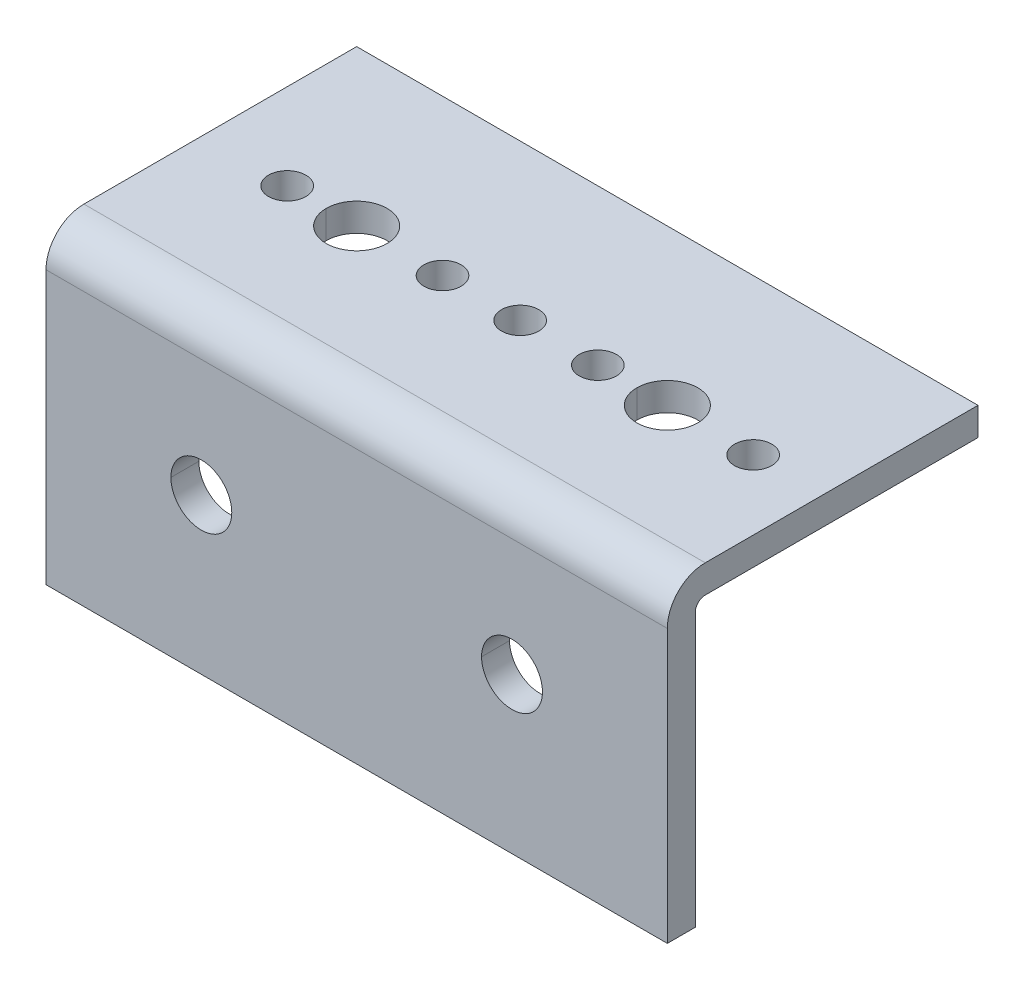
ISO-10303-21;
HEADER;
FILE_DESCRIPTION(('STEP AP214'),'2;1');
FILE_NAME('part.step','',(''),(''),'','','');
FILE_SCHEMA(('AUTOMOTIVE_DESIGN { 1 0 10303 214 1 1 1 1 }'));
ENDSEC;
DATA;
#1=APPLICATION_CONTEXT('core data for automotive mechanical design processes');
#2=APPLICATION_PROTOCOL_DEFINITION('international standard','automotive_design',2000,#1);
#3=PRODUCT_CONTEXT('',#1,'mechanical');
#4=PRODUCT('Part','Part','',(#3));
#5=PRODUCT_RELATED_PRODUCT_CATEGORY('part','',(#4));
#6=PRODUCT_DEFINITION_FORMATION('','',#4);
#7=PRODUCT_DEFINITION_CONTEXT('part definition',#1,'design');
#8=PRODUCT_DEFINITION('design','',#6,#7);
#9=PRODUCT_DEFINITION_SHAPE('','',#8);
#10=(LENGTH_UNIT() NAMED_UNIT(*) SI_UNIT(.MILLI.,.METRE.));
#11=(NAMED_UNIT(*) PLANE_ANGLE_UNIT() SI_UNIT($,.RADIAN.));
#12=(NAMED_UNIT(*) SI_UNIT($,.STERADIAN.) SOLID_ANGLE_UNIT());
#13=UNCERTAINTY_MEASURE_WITH_UNIT(LENGTH_MEASURE(1.E-05),#10,'distance_accuracy_value','');
#14=(GEOMETRIC_REPRESENTATION_CONTEXT(3) GLOBAL_UNCERTAINTY_ASSIGNED_CONTEXT((#13)) GLOBAL_UNIT_ASSIGNED_CONTEXT((#10,
#11,#12)) REPRESENTATION_CONTEXT('',''));
#15=CARTESIAN_POINT('',(0.,0.,0.));
#16=DIRECTION('',(0.,0.,1.));
#17=DIRECTION('',(1.,0.,0.));
#18=AXIS2_PLACEMENT_3D('',#15,#16,#17);
#19=CARTESIAN_POINT('',(-38.1,-25.4,25.4));
#20=DIRECTION('',(0.,0.,-1.));
#21=DIRECTION('',(1.,0.,0.));
#22=AXIS2_PLACEMENT_3D('',#19,#20,#21);
#23=CYLINDRICAL_SURFACE('',#22,2.4892);
#24=DIRECTION('',(0.,0.,-1.));
#25=VECTOR('',#24,1.);
#26=CARTESIAN_POINT('',(-40.5892,-25.4,25.4));
#27=LINE('',#26,#25);
#28=CARTESIAN_POINT('',(-40.5892,-25.4,25.4));
#29=VERTEX_POINT('',#28);
#30=CARTESIAN_POINT('',(-40.5892,-25.4,23.114));
#31=VERTEX_POINT('',#30);
#32=EDGE_CURVE('E160',#29,#31,#27,.T.);
#33=ORIENTED_EDGE('',*,*,#32,.F.);
#34=CARTESIAN_POINT('',(-38.1,-25.4,25.4));
#35=DIRECTION('',(0.,0.,-1.));
#36=DIRECTION('',(1.,0.,0.));
#37=AXIS2_PLACEMENT_3D('',#34,#35,#36);
#38=CIRCLE('',#37,2.4892);
#39=CARTESIAN_POINT('',(-35.6108,-25.4,25.4));
#40=VERTEX_POINT('',#39);
#41=EDGE_CURVE('E145',#40,#29,#38,.T.);
#42=ORIENTED_EDGE('',*,*,#41,.F.);
#43=DIRECTION('',(0.,0.,-1.));
#44=VECTOR('',#43,1.);
#45=CARTESIAN_POINT('',(-35.6108,-25.4,25.4));
#46=LINE('',#45,#44);
#47=CARTESIAN_POINT('',(-35.6108,-25.4,23.114));
#48=VERTEX_POINT('',#47);
#49=EDGE_CURVE('E168',#40,#48,#46,.T.);
#50=ORIENTED_EDGE('',*,*,#49,.T.);
#51=CARTESIAN_POINT('',(-38.1,-25.4,23.114));
#52=DIRECTION('',(0.,0.,-1.));
#53=DIRECTION('',(1.,0.,0.));
#54=AXIS2_PLACEMENT_3D('',#51,#52,#53);
#55=CIRCLE('',#54,2.4892);
#56=EDGE_CURVE('E58',#48,#31,#55,.T.);
#57=ORIENTED_EDGE('',*,*,#56,.T.);
#58=EDGE_LOOP('',(#33,#42,#50,#57));
#59=FACE_BOUND('',#58,.T.);
#60=ADVANCED_FACE('F47',(#59),#23,.F.);
#61=CARTESIAN_POINT('',(-12.7,-25.4,25.4));
#62=DIRECTION('',(0.,0.,-1.));
#63=DIRECTION('',(1.,0.,0.));
#64=AXIS2_PLACEMENT_3D('',#61,#62,#63);
#65=CYLINDRICAL_SURFACE('',#64,2.4892);
#66=DIRECTION('',(0.,0.,-1.));
#67=VECTOR('',#66,1.);
#68=CARTESIAN_POINT('',(-15.1892,-25.4,25.4));
#69=LINE('',#68,#67);
#70=CARTESIAN_POINT('',(-15.1892,-25.4,25.4));
#71=VERTEX_POINT('',#70);
#72=CARTESIAN_POINT('',(-15.1892,-25.4,23.114));
#73=VERTEX_POINT('',#72);
#74=EDGE_CURVE('E235',#71,#73,#69,.T.);
#75=ORIENTED_EDGE('',*,*,#74,.F.);
#76=CARTESIAN_POINT('',(-12.7,-25.4,25.4));
#77=DIRECTION('',(0.,0.,-1.));
#78=DIRECTION('',(1.,0.,0.));
#79=AXIS2_PLACEMENT_3D('',#76,#77,#78);
#80=CIRCLE('',#79,2.4892);
#81=CARTESIAN_POINT('',(-10.2108,-25.4,25.4));
#82=VERTEX_POINT('',#81);
#83=EDGE_CURVE('E155',#82,#71,#80,.T.);
#84=ORIENTED_EDGE('',*,*,#83,.F.);
#85=DIRECTION('',(0.,0.,-1.));
#86=VECTOR('',#85,1.);
#87=CARTESIAN_POINT('',(-10.2108,-25.4,25.4));
#88=LINE('',#87,#86);
#89=CARTESIAN_POINT('',(-10.2108,-25.4,23.114));
#90=VERTEX_POINT('',#89);
#91=EDGE_CURVE('E206',#82,#90,#88,.T.);
#92=ORIENTED_EDGE('',*,*,#91,.T.);
#93=CARTESIAN_POINT('',(-12.7,-25.4,23.114));
#94=DIRECTION('',(0.,0.,-1.));
#95=DIRECTION('',(1.,0.,0.));
#96=AXIS2_PLACEMENT_3D('',#93,#94,#95);
#97=CIRCLE('',#96,2.4892);
#98=EDGE_CURVE('E12',#90,#73,#97,.T.);
#99=ORIENTED_EDGE('',*,*,#98,.T.);
#100=EDGE_LOOP('',(#75,#84,#92,#99));
#101=FACE_BOUND('',#100,.T.);
#102=ADVANCED_FACE('F486',(#101),#65,.F.);
#103=CARTESIAN_POINT('',(-12.7,-12.7,12.7));
#104=DIRECTION('',(0.,-1.,0.));
#105=DIRECTION('',(-1.,0.,0.));
#106=AXIS2_PLACEMENT_3D('',#103,#104,#105);
#107=CYLINDRICAL_SURFACE('',#106,2.4892);
#108=DIRECTION('',(0.,-1.,0.));
#109=VECTOR('',#108,1.);
#110=CARTESIAN_POINT('',(-10.2108,-12.7,12.7));
#111=LINE('',#110,#109);
#112=CARTESIAN_POINT('',(-10.2108,-12.7,12.7));
#113=VERTEX_POINT('',#112);
#114=CARTESIAN_POINT('',(-10.2108,-14.986,12.7));
#115=VERTEX_POINT('',#114);
#116=EDGE_CURVE('E205',#113,#115,#111,.T.);
#117=ORIENTED_EDGE('',*,*,#116,.F.);
#118=CARTESIAN_POINT('',(-12.7,-12.7,12.7));
#119=DIRECTION('',(0.,-1.,0.));
#120=DIRECTION('',(-1.,0.,0.));
#121=AXIS2_PLACEMENT_3D('',#118,#119,#120);
#122=CIRCLE('',#121,2.4892);
#123=CARTESIAN_POINT('',(-15.1892,-12.7,12.7));
#124=VERTEX_POINT('',#123);
#125=EDGE_CURVE('E285',#124,#113,#122,.T.);
#126=ORIENTED_EDGE('',*,*,#125,.F.);
#127=DIRECTION('',(0.,-1.,0.));
#128=VECTOR('',#127,1.);
#129=CARTESIAN_POINT('',(-15.1892,-12.7,12.7));
#130=LINE('',#129,#128);
#131=CARTESIAN_POINT('',(-15.1892,-14.986,12.7));
#132=VERTEX_POINT('',#131);
#133=EDGE_CURVE('E279',#124,#132,#130,.T.);
#134=ORIENTED_EDGE('',*,*,#133,.T.);
#135=CARTESIAN_POINT('',(-12.7,-14.986,12.7));
#136=DIRECTION('',(0.,-1.,0.));
#137=DIRECTION('',(-1.,0.,0.));
#138=AXIS2_PLACEMENT_3D('',#135,#136,#137);
#139=CIRCLE('',#138,2.4892);
#140=EDGE_CURVE('E273',#132,#115,#139,.T.);
#141=ORIENTED_EDGE('',*,*,#140,.T.);
#142=EDGE_LOOP('',(#117,#126,#134,#141));
#143=FACE_BOUND('',#142,.T.);
#144=ADVANCED_FACE('F49',(#143),#107,.F.);
#145=CARTESIAN_POINT('',(-38.1,-12.7,12.7));
#146=DIRECTION('',(0.,-1.,0.));
#147=DIRECTION('',(-1.,0.,0.));
#148=AXIS2_PLACEMENT_3D('',#145,#146,#147);
#149=CYLINDRICAL_SURFACE('',#148,2.4892);
#150=DIRECTION('',(0.,-1.,0.));
#151=VECTOR('',#150,1.);
#152=CARTESIAN_POINT('',(-35.6108,-12.7,12.7));
#153=LINE('',#152,#151);
#154=CARTESIAN_POINT('',(-35.6108,-12.7,12.7));
#155=VERTEX_POINT('',#154);
#156=CARTESIAN_POINT('',(-35.6108,-14.986,12.7));
#157=VERTEX_POINT('',#156);
#158=EDGE_CURVE('E181',#155,#157,#153,.T.);
#159=ORIENTED_EDGE('',*,*,#158,.F.);
#160=CARTESIAN_POINT('',(-38.1,-12.7,12.7));
#161=DIRECTION('',(0.,-1.,0.));
#162=DIRECTION('',(-1.,0.,0.));
#163=AXIS2_PLACEMENT_3D('',#160,#161,#162);
#164=CIRCLE('',#163,2.4892);
#165=CARTESIAN_POINT('',(-40.5892,-12.7,12.7));
#166=VERTEX_POINT('',#165);
#167=EDGE_CURVE('E280',#166,#155,#164,.T.);
#168=ORIENTED_EDGE('',*,*,#167,.F.);
#169=DIRECTION('',(0.,-1.,0.));
#170=VECTOR('',#169,1.);
#171=CARTESIAN_POINT('',(-40.5892,-12.7,12.7));
#172=LINE('',#171,#170);
#173=CARTESIAN_POINT('',(-40.5892,-14.986,12.7));
#174=VERTEX_POINT('',#173);
#175=EDGE_CURVE('E223',#166,#174,#172,.T.);
#176=ORIENTED_EDGE('',*,*,#175,.T.);
#177=CARTESIAN_POINT('',(-38.1,-14.986,12.7));
#178=DIRECTION('',(0.,-1.,0.));
#179=DIRECTION('',(-1.,0.,0.));
#180=AXIS2_PLACEMENT_3D('',#177,#178,#179);
#181=CIRCLE('',#180,2.4892);
#182=EDGE_CURVE('E183',#174,#157,#181,.T.);
#183=ORIENTED_EDGE('',*,*,#182,.T.);
#184=EDGE_LOOP('',(#159,#168,#176,#183));
#185=FACE_BOUND('',#184,.T.);
#186=ADVANCED_FACE('F368',(#185),#149,.F.);
#187=CARTESIAN_POINT('',(-50.8,-12.7,25.400012));
#188=DIRECTION('',(1.,0.,0.));
#189=DIRECTION('',(0.,-1.,0.));
#190=AXIS2_PLACEMENT_3D('',#187,#188,#189);
#191=PLANE('',#190);
#192=CARTESIAN_POINT('',(-50.8,-15.7988,22.3012));
#193=DIRECTION('',(-1.,0.,0.));
#194=DIRECTION('',(0.,-1.,0.));
#195=AXIS2_PLACEMENT_3D('',#192,#193,#194);
#196=CIRCLE('',#195,3.0988);
#197=CARTESIAN_POINT('',(-50.8,-15.7988,25.4));
#198=VERTEX_POINT('',#197);
#199=CARTESIAN_POINT('',(-50.8,-12.7,22.3012));
#200=VERTEX_POINT('',#199);
#201=EDGE_CURVE('E51',#198,#200,#196,.T.);
#202=ORIENTED_EDGE('',*,*,#201,.T.);
#203=DIRECTION('',(0.,0.,-1.));
#204=VECTOR('',#203,1.);
#205=CARTESIAN_POINT('',(-50.8,-12.7,25.400012));
#206=LINE('',#205,#204);
#207=CARTESIAN_POINT('',(-50.8,-12.7,0.));
#208=VERTEX_POINT('',#207);
#209=EDGE_CURVE('E216',#200,#208,#206,.T.);
#210=ORIENTED_EDGE('',*,*,#209,.T.);
#211=DIRECTION('',(0.,-1.,0.));
#212=VECTOR('',#211,1.);
#213=CARTESIAN_POINT('',(-50.8,-12.7,0.));
#214=LINE('',#213,#212);
#215=CARTESIAN_POINT('',(-50.8,-14.986,0.));
#216=VERTEX_POINT('',#215);
#217=EDGE_CURVE('E229',#208,#216,#214,.T.);
#218=ORIENTED_EDGE('',*,*,#217,.T.);
#219=DIRECTION('',(0.,0.,-1.));
#220=VECTOR('',#219,1.);
#221=CARTESIAN_POINT('',(-50.8,-14.986,25.4));
#222=LINE('',#221,#220);
#223=CARTESIAN_POINT('',(-50.8,-14.986,22.3012));
#224=VERTEX_POINT('',#223);
#225=EDGE_CURVE('E274',#224,#216,#222,.T.);
#226=ORIENTED_EDGE('',*,*,#225,.F.);
#227=CARTESIAN_POINT('',(-50.8,-15.7988,22.3012));
#228=DIRECTION('',(-1.,0.,0.));
#229=DIRECTION('',(0.,-1.,0.));
#230=AXIS2_PLACEMENT_3D('',#227,#228,#229);
#231=CIRCLE('',#230,0.8128);
#232=CARTESIAN_POINT('',(-50.8,-15.7988,23.114));
#233=VERTEX_POINT('',#232);
#234=EDGE_CURVE('E253',#233,#224,#231,.T.);
#235=ORIENTED_EDGE('',*,*,#234,.F.);
#236=DIRECTION('',(0.,1.,0.));
#237=VECTOR('',#236,1.);
#238=CARTESIAN_POINT('',(-50.8,-12.7,23.114));
#239=LINE('',#238,#237);
#240=CARTESIAN_POINT('',(-50.8,-38.1,23.114));
#241=VERTEX_POINT('',#240);
#242=EDGE_CURVE('E298',#241,#233,#239,.T.);
#243=ORIENTED_EDGE('',*,*,#242,.F.);
#244=DIRECTION('',(0.,0.,-1.));
#245=VECTOR('',#244,1.);
#246=CARTESIAN_POINT('',(-50.8,-38.1,25.400012));
#247=LINE('',#246,#245);
#248=CARTESIAN_POINT('',(-50.8,-38.1,25.4));
#249=VERTEX_POINT('',#248);
#250=EDGE_CURVE('E259',#249,#241,#247,.T.);
#251=ORIENTED_EDGE('',*,*,#250,.F.);
#252=DIRECTION('',(0.,1.,0.));
#253=VECTOR('',#252,1.);
#254=CARTESIAN_POINT('',(-50.8,-12.7,25.4));
#255=LINE('',#254,#253);
#256=EDGE_CURVE('E193',#249,#198,#255,.T.);
#257=ORIENTED_EDGE('',*,*,#256,.T.);
#258=EDGE_LOOP('',(#202,#210,#218,#226,#235,#243,#251,#257));
#259=FACE_BOUND('',#258,.T.);
#260=ADVANCED_FACE('F326',(#259),#191,.F.);
#261=CARTESIAN_POINT('',(0.,-12.7,25.400012));
#262=DIRECTION('',(1.,0.,0.));
#263=DIRECTION('',(0.,-1.,0.));
#264=AXIS2_PLACEMENT_3D('',#261,#262,#263);
#265=PLANE('',#264);
#266=DIRECTION('',(0.,1.,0.));
#267=VECTOR('',#266,1.);
#268=CARTESIAN_POINT('',(0.,-12.7,25.4));
#269=LINE('',#268,#267);
#270=CARTESIAN_POINT('',(0.,-38.1,25.4));
#271=VERTEX_POINT('',#270);
#272=CARTESIAN_POINT('',(0.,-15.7988,25.4));
#273=VERTEX_POINT('',#272);
#274=EDGE_CURVE('E156',#271,#273,#269,.T.);
#275=ORIENTED_EDGE('',*,*,#274,.F.);
#276=DIRECTION('',(0.,0.,-1.));
#277=VECTOR('',#276,1.);
#278=CARTESIAN_POINT('',(0.,-38.1,25.400012));
#279=LINE('',#278,#277);
#280=CARTESIAN_POINT('',(0.,-38.1,23.114));
#281=VERTEX_POINT('',#280);
#282=EDGE_CURVE('E207',#271,#281,#279,.T.);
#283=ORIENTED_EDGE('',*,*,#282,.T.);
#284=DIRECTION('',(0.,1.,0.));
#285=VECTOR('',#284,1.);
#286=CARTESIAN_POINT('',(0.,-12.7,23.114));
#287=LINE('',#286,#285);
#288=CARTESIAN_POINT('',(0.,-15.7988,23.114));
#289=VERTEX_POINT('',#288);
#290=EDGE_CURVE('E71',#281,#289,#287,.T.);
#291=ORIENTED_EDGE('',*,*,#290,.T.);
#292=CARTESIAN_POINT('',(0.,-15.7988,22.3012));
#293=DIRECTION('',(-1.,0.,0.));
#294=DIRECTION('',(0.,-1.,0.));
#295=AXIS2_PLACEMENT_3D('',#292,#293,#294);
#296=CIRCLE('',#295,0.8128);
#297=CARTESIAN_POINT('',(0.,-14.986,22.3012));
#298=VERTEX_POINT('',#297);
#299=EDGE_CURVE('E264',#289,#298,#296,.T.);
#300=ORIENTED_EDGE('',*,*,#299,.T.);
#301=DIRECTION('',(0.,0.,-1.));
#302=VECTOR('',#301,1.);
#303=CARTESIAN_POINT('',(0.,-14.986,25.4));
#304=LINE('',#303,#302);
#305=CARTESIAN_POINT('',(0.,-14.986,0.));
#306=VERTEX_POINT('',#305);
#307=EDGE_CURVE('E269',#298,#306,#304,.T.);
#308=ORIENTED_EDGE('',*,*,#307,.T.);
#309=DIRECTION('',(0.,-1.,0.));
#310=VECTOR('',#309,1.);
#311=CARTESIAN_POINT('',(0.,-12.7,0.));
#312=LINE('',#311,#310);
#313=CARTESIAN_POINT('',(0.,-12.7,0.));
#314=VERTEX_POINT('',#313);
#315=EDGE_CURVE('E225',#314,#306,#312,.T.);
#316=ORIENTED_EDGE('',*,*,#315,.F.);
#317=DIRECTION('',(0.,0.,-1.));
#318=VECTOR('',#317,1.);
#319=CARTESIAN_POINT('',(0.,-12.7,25.400012));
#320=LINE('',#319,#318);
#321=CARTESIAN_POINT('',(0.,-12.7,22.3012));
#322=VERTEX_POINT('',#321);
#323=EDGE_CURVE('E348',#322,#314,#320,.T.);
#324=ORIENTED_EDGE('',*,*,#323,.F.);
#325=CARTESIAN_POINT('',(0.,-15.7988,22.3012));
#326=DIRECTION('',(-1.,0.,0.));
#327=DIRECTION('',(0.,-1.,0.));
#328=AXIS2_PLACEMENT_3D('',#325,#326,#327);
#329=CIRCLE('',#328,3.0988);
#330=EDGE_CURVE('E234',#273,#322,#329,.T.);
#331=ORIENTED_EDGE('',*,*,#330,.F.);
#332=EDGE_LOOP('',(#275,#283,#291,#300,#308,#316,#324,#331));
#333=FACE_BOUND('',#332,.T.);
#334=ADVANCED_FACE('F403',(#333),#265,.T.);
#335=CARTESIAN_POINT('',(-787.4,-12.7,23.114));
#336=DIRECTION('',(0.,0.,1.));
#337=DIRECTION('',(-1.,0.,0.));
#338=AXIS2_PLACEMENT_3D('',#335,#336,#337);
#339=PLANE('',#338);
#340=ORIENTED_EDGE('',*,*,#98,.F.);
#341=CARTESIAN_POINT('',(-12.7,-25.4,23.114));
#342=DIRECTION('',(0.,0.,-1.));
#343=DIRECTION('',(1.,0.,0.));
#344=AXIS2_PLACEMENT_3D('',#341,#342,#343);
#345=CIRCLE('',#344,2.4892);
#346=EDGE_CURVE('E390',#73,#90,#345,.T.);
#347=ORIENTED_EDGE('',*,*,#346,.F.);
#348=EDGE_LOOP('',(#340,#347));
#349=FACE_BOUND('',#348,.T.);
#350=ORIENTED_EDGE('',*,*,#56,.F.);
#351=CARTESIAN_POINT('',(-38.1,-25.4,23.114));
#352=DIRECTION('',(0.,0.,-1.));
#353=DIRECTION('',(1.,0.,0.));
#354=AXIS2_PLACEMENT_3D('',#351,#352,#353);
#355=CIRCLE('',#354,2.4892);
#356=EDGE_CURVE('E165',#31,#48,#355,.T.);
#357=ORIENTED_EDGE('',*,*,#356,.F.);
#358=EDGE_LOOP('',(#350,#357));
#359=FACE_BOUND('',#358,.T.);
#360=DIRECTION('',(1.,0.,0.));
#361=VECTOR('',#360,1.);
#362=CARTESIAN_POINT('',(-787.4,-38.1,23.114));
#363=LINE('',#362,#361);
#364=EDGE_CURVE('E263',#241,#281,#363,.T.);
#365=ORIENTED_EDGE('',*,*,#364,.F.);
#366=ORIENTED_EDGE('',*,*,#242,.T.);
#367=DIRECTION('',(-1.,0.,0.));
#368=VECTOR('',#367,1.);
#369=CARTESIAN_POINT('',(-787.4,-15.7988,23.114));
#370=LINE('',#369,#368);
#371=EDGE_CURVE('E249',#289,#233,#370,.T.);
#372=ORIENTED_EDGE('',*,*,#371,.F.);
#373=ORIENTED_EDGE('',*,*,#290,.F.);
#374=EDGE_LOOP('',(#365,#366,#372,#373));
#375=FACE_BOUND('',#374,.T.);
#376=ADVANCED_FACE('F408',(#349,#359,#375),#339,.F.);
#377=CARTESIAN_POINT('',(-787.4,-38.1,23.114));
#378=DIRECTION('',(0.,1.,0.));
#379=DIRECTION('',(1.,0.,0.));
#380=AXIS2_PLACEMENT_3D('',#377,#378,#379);
#381=PLANE('',#380);
#382=DIRECTION('',(1.,0.,0.));
#383=VECTOR('',#382,1.);
#384=CARTESIAN_POINT('',(-787.4,-38.1,25.4));
#385=LINE('',#384,#383);
#386=EDGE_CURVE('E198',#249,#271,#385,.T.);
#387=ORIENTED_EDGE('',*,*,#386,.F.);
#388=ORIENTED_EDGE('',*,*,#250,.T.);
#389=ORIENTED_EDGE('',*,*,#364,.T.);
#390=ORIENTED_EDGE('',*,*,#282,.F.);
#391=EDGE_LOOP('',(#387,#388,#389,#390));
#392=FACE_BOUND('',#391,.T.);
#393=ADVANCED_FACE('F407',(#392),#381,.F.);
#394=CARTESIAN_POINT('',(-787.4,-15.7988,22.3012));
#395=DIRECTION('',(1.,0.,0.));
#396=DIRECTION('',(0.,-1.,0.));
#397=AXIS2_PLACEMENT_3D('',#394,#395,#396);
#398=CYLINDRICAL_SURFACE('',#397,0.8128);
#399=ORIENTED_EDGE('',*,*,#371,.T.);
#400=ORIENTED_EDGE('',*,*,#234,.T.);
#401=DIRECTION('',(-1.,0.,0.));
#402=VECTOR('',#401,1.);
#403=CARTESIAN_POINT('',(-787.4,-14.986,22.3012));
#404=LINE('',#403,#402);
#405=EDGE_CURVE('E199',#298,#224,#404,.T.);
#406=ORIENTED_EDGE('',*,*,#405,.F.);
#407=ORIENTED_EDGE('',*,*,#299,.F.);
#408=EDGE_LOOP('',(#399,#400,#406,#407));
#409=FACE_BOUND('',#408,.T.);
#410=ADVANCED_FACE('F321',(#409),#398,.F.);
#411=CARTESIAN_POINT('',(-787.4,-12.7,25.4));
#412=DIRECTION('',(0.,0.,1.));
#413=DIRECTION('',(-1.,0.,0.));
#414=AXIS2_PLACEMENT_3D('',#411,#412,#413);
#415=PLANE('',#414);
#416=ORIENTED_EDGE('',*,*,#83,.T.);
#417=CARTESIAN_POINT('',(-12.7,-25.4,25.4));
#418=DIRECTION('',(0.,0.,-1.));
#419=DIRECTION('',(1.,0.,0.));
#420=AXIS2_PLACEMENT_3D('',#417,#418,#419);
#421=CIRCLE('',#420,2.4892);
#422=EDGE_CURVE('E244',#71,#82,#421,.T.);
#423=ORIENTED_EDGE('',*,*,#422,.T.);
#424=EDGE_LOOP('',(#416,#423));
#425=FACE_BOUND('',#424,.T.);
#426=ORIENTED_EDGE('',*,*,#41,.T.);
#427=CARTESIAN_POINT('',(-38.1,-25.4,25.4));
#428=DIRECTION('',(0.,0.,-1.));
#429=DIRECTION('',(1.,0.,0.));
#430=AXIS2_PLACEMENT_3D('',#427,#428,#429);
#431=CIRCLE('',#430,2.4892);
#432=EDGE_CURVE('E150',#29,#40,#431,.T.);
#433=ORIENTED_EDGE('',*,*,#432,.T.);
#434=EDGE_LOOP('',(#426,#433));
#435=FACE_BOUND('',#434,.T.);
#436=ORIENTED_EDGE('',*,*,#256,.F.);
#437=ORIENTED_EDGE('',*,*,#386,.T.);
#438=ORIENTED_EDGE('',*,*,#274,.T.);
#439=DIRECTION('',(-1.,0.,0.));
#440=VECTOR('',#439,1.);
#441=CARTESIAN_POINT('',(-787.4,-15.7988,25.4));
#442=LINE('',#441,#440);
#443=EDGE_CURVE('E230',#273,#198,#442,.T.);
#444=ORIENTED_EDGE('',*,*,#443,.T.);
#445=EDGE_LOOP('',(#436,#437,#438,#444));
#446=FACE_BOUND('',#445,.T.);
#447=ADVANCED_FACE('F147',(#425,#435,#446),#415,.T.);
#448=CARTESIAN_POINT('',(-787.4,-14.986,25.4));
#449=DIRECTION('',(0.,1.,0.));
#450=DIRECTION('',(1.,0.,0.));
#451=AXIS2_PLACEMENT_3D('',#448,#449,#450);
#452=PLANE('',#451);
#453=CARTESIAN_POINT('',(-5.68138413389015,-14.986,12.7));
#454=DIRECTION('',(0.,1.,0.));
#455=DIRECTION('',(0.,0.,1.));
#456=AXIS2_PLACEMENT_3D('',#453,#454,#455);
#457=CIRCLE('',#456,1.524);
#458=CARTESIAN_POINT('',(-5.68138413389015,-14.986,14.224));
#459=VERTEX_POINT('',#458);
#460=EDGE_CURVE('E170',#459,#459,#457,.T.);
#461=ORIENTED_EDGE('',*,*,#460,.T.);
#462=EDGE_LOOP('',(#461));
#463=FACE_BOUND('',#462,.T.);
#464=CARTESIAN_POINT('',(-43.7813841338901,-14.986,12.7000000000002));
#465=DIRECTION('',(0.,1.,0.));
#466=DIRECTION('',(0.,0.,1.));
#467=AXIS2_PLACEMENT_3D('',#464,#465,#466);
#468=CIRCLE('',#467,1.524);
#469=CARTESIAN_POINT('',(-43.7813841338901,-14.986,14.2240000000002));
#470=VERTEX_POINT('',#469);
#471=EDGE_CURVE('E176',#470,#470,#468,.T.);
#472=ORIENTED_EDGE('',*,*,#471,.T.);
#473=EDGE_LOOP('',(#472));
#474=FACE_BOUND('',#473,.T.);
#475=CARTESIAN_POINT('',(-31.0813841338901,-14.986,12.7000000000001));
#476=DIRECTION('',(0.,1.,0.));
#477=DIRECTION('',(0.,0.,1.));
#478=AXIS2_PLACEMENT_3D('',#475,#476,#477);
#479=CIRCLE('',#478,1.524);
#480=CARTESIAN_POINT('',(-31.0813841338901,-14.986,14.2240000000001));
#481=VERTEX_POINT('',#480);
#482=EDGE_CURVE('E722',#481,#481,#479,.T.);
#483=ORIENTED_EDGE('',*,*,#482,.T.);
#484=EDGE_LOOP('',(#483));
#485=FACE_BOUND('',#484,.T.);
#486=CARTESIAN_POINT('',(-24.7313841338901,-14.986,12.7));
#487=DIRECTION('',(0.,1.,0.));
#488=DIRECTION('',(0.,0.,1.));
#489=AXIS2_PLACEMENT_3D('',#486,#487,#488);
#490=CIRCLE('',#489,1.52400000000001);
#491=CARTESIAN_POINT('',(-24.7313841338901,-14.986,14.2240000000001));
#492=VERTEX_POINT('',#491);
#493=EDGE_CURVE('E726',#492,#492,#490,.T.);
#494=ORIENTED_EDGE('',*,*,#493,.T.);
#495=EDGE_LOOP('',(#494));
#496=FACE_BOUND('',#495,.T.);
#497=CARTESIAN_POINT('',(-18.3813841338902,-14.986,12.7));
#498=DIRECTION('',(0.,1.,0.));
#499=DIRECTION('',(0.,0.,1.));
#500=AXIS2_PLACEMENT_3D('',#497,#498,#499);
#501=CIRCLE('',#500,1.524);
#502=CARTESIAN_POINT('',(-18.3813841338902,-14.986,14.224));
#503=VERTEX_POINT('',#502);
#504=EDGE_CURVE('E729',#503,#503,#501,.T.);
#505=ORIENTED_EDGE('',*,*,#504,.T.);
#506=EDGE_LOOP('',(#505));
#507=FACE_BOUND('',#506,.T.);
#508=ORIENTED_EDGE('',*,*,#182,.F.);
#509=CARTESIAN_POINT('',(-38.1,-14.986,12.7));
#510=DIRECTION('',(0.,-1.,0.));
#511=DIRECTION('',(-1.,0.,0.));
#512=AXIS2_PLACEMENT_3D('',#509,#510,#511);
#513=CIRCLE('',#512,2.4892);
#514=EDGE_CURVE('E305',#157,#174,#513,.T.);
#515=ORIENTED_EDGE('',*,*,#514,.F.);
#516=EDGE_LOOP('',(#508,#515));
#517=FACE_BOUND('',#516,.T.);
#518=ORIENTED_EDGE('',*,*,#140,.F.);
#519=CARTESIAN_POINT('',(-12.7,-14.986,12.7));
#520=DIRECTION('',(0.,-1.,0.));
#521=DIRECTION('',(-1.,0.,0.));
#522=AXIS2_PLACEMENT_3D('',#519,#520,#521);
#523=CIRCLE('',#522,2.4892);
#524=EDGE_CURVE('E275',#115,#132,#523,.T.);
#525=ORIENTED_EDGE('',*,*,#524,.F.);
#526=EDGE_LOOP('',(#518,#525));
#527=FACE_BOUND('',#526,.T.);
#528=ORIENTED_EDGE('',*,*,#405,.T.);
#529=ORIENTED_EDGE('',*,*,#225,.T.);
#530=DIRECTION('',(-1.,0.,0.));
#531=VECTOR('',#530,1.);
#532=CARTESIAN_POINT('',(-787.4,-14.986,0.));
#533=LINE('',#532,#531);
#534=EDGE_CURVE('E256',#306,#216,#533,.T.);
#535=ORIENTED_EDGE('',*,*,#534,.F.);
#536=ORIENTED_EDGE('',*,*,#307,.F.);
#537=EDGE_LOOP('',(#528,#529,#535,#536));
#538=FACE_BOUND('',#537,.T.);
#539=ADVANCED_FACE('F331',(#463,#474,#485,#496,#507,#517,#527,#538),#452,.F.);
#540=CARTESIAN_POINT('',(-787.4,-15.7988,22.3012));
#541=DIRECTION('',(1.,0.,0.));
#542=DIRECTION('',(0.,-1.,0.));
#543=AXIS2_PLACEMENT_3D('',#540,#541,#542);
#544=CYLINDRICAL_SURFACE('',#543,3.0988);
#545=ORIENTED_EDGE('',*,*,#201,.F.);
#546=ORIENTED_EDGE('',*,*,#443,.F.);
#547=ORIENTED_EDGE('',*,*,#330,.T.);
#548=DIRECTION('',(-1.,0.,0.));
#549=VECTOR('',#548,1.);
#550=CARTESIAN_POINT('',(-787.4,-12.7,22.3012));
#551=LINE('',#550,#549);
#552=EDGE_CURVE('E222',#322,#200,#551,.T.);
#553=ORIENTED_EDGE('',*,*,#552,.T.);
#554=EDGE_LOOP('',(#545,#546,#547,#553));
#555=FACE_BOUND('',#554,.T.);
#556=ADVANCED_FACE('F412',(#555),#544,.T.);
#557=CARTESIAN_POINT('',(-787.4,-12.7,0.));
#558=DIRECTION('',(0.,0.,1.));
#559=DIRECTION('',(-1.,0.,0.));
#560=AXIS2_PLACEMENT_3D('',#557,#558,#559);
#561=PLANE('',#560);
#562=ORIENTED_EDGE('',*,*,#534,.T.);
#563=ORIENTED_EDGE('',*,*,#217,.F.);
#564=DIRECTION('',(-1.,0.,0.));
#565=VECTOR('',#564,1.);
#566=CARTESIAN_POINT('',(-787.4,-12.7,0.));
#567=LINE('',#566,#565);
#568=EDGE_CURVE('E385',#314,#208,#567,.T.);
#569=ORIENTED_EDGE('',*,*,#568,.F.);
#570=ORIENTED_EDGE('',*,*,#315,.T.);
#571=EDGE_LOOP('',(#562,#563,#569,#570));
#572=FACE_BOUND('',#571,.T.);
#573=ADVANCED_FACE('F439',(#572),#561,.F.);
#574=CARTESIAN_POINT('',(-787.4,-12.7,25.4));
#575=DIRECTION('',(0.,1.,0.));
#576=DIRECTION('',(1.,0.,0.));
#577=AXIS2_PLACEMENT_3D('',#574,#575,#576);
#578=PLANE('',#577);
#579=CARTESIAN_POINT('',(-5.68138413389015,-12.7,12.7));
#580=DIRECTION('',(0.,1.,0.));
#581=DIRECTION('',(0.,0.,1.));
#582=AXIS2_PLACEMENT_3D('',#579,#580,#581);
#583=CIRCLE('',#582,1.524);
#584=CARTESIAN_POINT('',(-5.68138413389015,-12.7,14.224));
#585=VERTEX_POINT('',#584);
#586=EDGE_CURVE('E713',#585,#585,#583,.T.);
#587=ORIENTED_EDGE('',*,*,#586,.F.);
#588=EDGE_LOOP('',(#587));
#589=FACE_BOUND('',#588,.T.);
#590=CARTESIAN_POINT('',(-43.7813841338901,-12.7,12.7000000000002));
#591=DIRECTION('',(0.,1.,0.));
#592=DIRECTION('',(0.,0.,1.));
#593=AXIS2_PLACEMENT_3D('',#590,#591,#592);
#594=CIRCLE('',#593,1.524);
#595=CARTESIAN_POINT('',(-43.7813841338901,-12.7,14.2240000000002));
#596=VERTEX_POINT('',#595);
#597=EDGE_CURVE('E741',#596,#596,#594,.T.);
#598=ORIENTED_EDGE('',*,*,#597,.F.);
#599=EDGE_LOOP('',(#598));
#600=FACE_BOUND('',#599,.T.);
#601=CARTESIAN_POINT('',(-31.0813841338901,-12.7,12.7000000000001));
#602=DIRECTION('',(0.,1.,0.));
#603=DIRECTION('',(0.,0.,1.));
#604=AXIS2_PLACEMENT_3D('',#601,#602,#603);
#605=CIRCLE('',#604,1.524);
#606=CARTESIAN_POINT('',(-31.0813841338901,-12.7,14.2240000000001));
#607=VERTEX_POINT('',#606);
#608=EDGE_CURVE('E744',#607,#607,#605,.T.);
#609=ORIENTED_EDGE('',*,*,#608,.F.);
#610=EDGE_LOOP('',(#609));
#611=FACE_BOUND('',#610,.T.);
#612=CARTESIAN_POINT('',(-24.7313841338901,-12.7,12.7));
#613=DIRECTION('',(0.,1.,0.));
#614=DIRECTION('',(0.,0.,1.));
#615=AXIS2_PLACEMENT_3D('',#612,#613,#614);
#616=CIRCLE('',#615,1.52400000000001);
#617=CARTESIAN_POINT('',(-24.7313841338901,-12.7,14.2240000000001));
#618=VERTEX_POINT('',#617);
#619=EDGE_CURVE('E735',#618,#618,#616,.T.);
#620=ORIENTED_EDGE('',*,*,#619,.F.);
#621=EDGE_LOOP('',(#620));
#622=FACE_BOUND('',#621,.T.);
#623=CARTESIAN_POINT('',(-18.3813841338902,-12.7,12.7));
#624=DIRECTION('',(0.,1.,0.));
#625=DIRECTION('',(0.,0.,1.));
#626=AXIS2_PLACEMENT_3D('',#623,#624,#625);
#627=CIRCLE('',#626,1.524);
#628=CARTESIAN_POINT('',(-18.3813841338902,-12.7,14.224));
#629=VERTEX_POINT('',#628);
#630=EDGE_CURVE('E731',#629,#629,#627,.T.);
#631=ORIENTED_EDGE('',*,*,#630,.F.);
#632=EDGE_LOOP('',(#631));
#633=FACE_BOUND('',#632,.T.);
#634=ORIENTED_EDGE('',*,*,#167,.T.);
#635=CARTESIAN_POINT('',(-38.1,-12.7,12.7));
#636=DIRECTION('',(0.,-1.,0.));
#637=DIRECTION('',(-1.,0.,0.));
#638=AXIS2_PLACEMENT_3D('',#635,#636,#637);
#639=CIRCLE('',#638,2.4892);
#640=EDGE_CURVE('E290',#155,#166,#639,.T.);
#641=ORIENTED_EDGE('',*,*,#640,.T.);
#642=EDGE_LOOP('',(#634,#641));
#643=FACE_BOUND('',#642,.T.);
#644=ORIENTED_EDGE('',*,*,#125,.T.);
#645=CARTESIAN_POINT('',(-12.7,-12.7,12.7));
#646=DIRECTION('',(0.,-1.,0.));
#647=DIRECTION('',(-1.,0.,0.));
#648=AXIS2_PLACEMENT_3D('',#645,#646,#647);
#649=CIRCLE('',#648,2.4892);
#650=EDGE_CURVE('E200',#113,#124,#649,.T.);
#651=ORIENTED_EDGE('',*,*,#650,.T.);
#652=EDGE_LOOP('',(#644,#651));
#653=FACE_BOUND('',#652,.T.);
#654=ORIENTED_EDGE('',*,*,#209,.F.);
#655=ORIENTED_EDGE('',*,*,#552,.F.);
#656=ORIENTED_EDGE('',*,*,#323,.T.);
#657=ORIENTED_EDGE('',*,*,#568,.T.);
#658=EDGE_LOOP('',(#654,#655,#656,#657));
#659=FACE_BOUND('',#658,.T.);
#660=ADVANCED_FACE('F508',(#589,#600,#611,#622,#633,#643,#653,#659),#578,.T.);
#661=CARTESIAN_POINT('',(-38.1,-12.7,12.7));
#662=DIRECTION('',(0.,-1.,0.));
#663=DIRECTION('',(-1.,0.,0.));
#664=AXIS2_PLACEMENT_3D('',#661,#662,#663);
#665=CYLINDRICAL_SURFACE('',#664,2.4892);
#666=ORIENTED_EDGE('',*,*,#640,.F.);
#667=ORIENTED_EDGE('',*,*,#158,.T.);
#668=ORIENTED_EDGE('',*,*,#514,.T.);
#669=ORIENTED_EDGE('',*,*,#175,.F.);
#670=EDGE_LOOP('',(#666,#667,#668,#669));
#671=FACE_BOUND('',#670,.T.);
#672=ADVANCED_FACE('F379',(#671),#665,.F.);
#673=CARTESIAN_POINT('',(-12.7,-12.7,12.7));
#674=DIRECTION('',(0.,-1.,0.));
#675=DIRECTION('',(-1.,0.,0.));
#676=AXIS2_PLACEMENT_3D('',#673,#674,#675);
#677=CYLINDRICAL_SURFACE('',#676,2.4892);
#678=ORIENTED_EDGE('',*,*,#650,.F.);
#679=ORIENTED_EDGE('',*,*,#116,.T.);
#680=ORIENTED_EDGE('',*,*,#524,.T.);
#681=ORIENTED_EDGE('',*,*,#133,.F.);
#682=EDGE_LOOP('',(#678,#679,#680,#681));
#683=FACE_BOUND('',#682,.T.);
#684=ADVANCED_FACE('F467',(#683),#677,.F.);
#685=CARTESIAN_POINT('',(-12.7,-25.4,25.4));
#686=DIRECTION('',(0.,0.,-1.));
#687=DIRECTION('',(1.,0.,0.));
#688=AXIS2_PLACEMENT_3D('',#685,#686,#687);
#689=CYLINDRICAL_SURFACE('',#688,2.4892);
#690=ORIENTED_EDGE('',*,*,#422,.F.);
#691=ORIENTED_EDGE('',*,*,#74,.T.);
#692=ORIENTED_EDGE('',*,*,#346,.T.);
#693=ORIENTED_EDGE('',*,*,#91,.F.);
#694=EDGE_LOOP('',(#690,#691,#692,#693));
#695=FACE_BOUND('',#694,.T.);
#696=ADVANCED_FACE('F448',(#695),#689,.F.);
#697=CARTESIAN_POINT('',(-38.1,-25.4,25.4));
#698=DIRECTION('',(0.,0.,-1.));
#699=DIRECTION('',(1.,0.,0.));
#700=AXIS2_PLACEMENT_3D('',#697,#698,#699);
#701=CYLINDRICAL_SURFACE('',#700,2.4892);
#702=ORIENTED_EDGE('',*,*,#432,.F.);
#703=ORIENTED_EDGE('',*,*,#32,.T.);
#704=ORIENTED_EDGE('',*,*,#356,.T.);
#705=ORIENTED_EDGE('',*,*,#49,.F.);
#706=EDGE_LOOP('',(#702,#703,#704,#705));
#707=FACE_BOUND('',#706,.T.);
#708=ADVANCED_FACE('F167',(#707),#701,.F.);
#709=CARTESIAN_POINT('',(-18.3813841338902,-15.24,12.7));
#710=DIRECTION('',(0.,1.,0.));
#711=DIRECTION('',(0.,0.,1.));
#712=AXIS2_PLACEMENT_3D('',#709,#710,#711);
#713=CYLINDRICAL_SURFACE('',#712,1.524);
#714=ORIENTED_EDGE('',*,*,#630,.T.);
#715=EDGE_LOOP('',(#714));
#716=FACE_BOUND('',#715,.T.);
#717=ORIENTED_EDGE('',*,*,#504,.F.);
#718=EDGE_LOOP('',(#717));
#719=FACE_BOUND('',#718,.T.);
#720=ADVANCED_FACE('F447',(#716,#719),#713,.F.);
#721=CARTESIAN_POINT('',(-24.7313841338901,-15.24,12.7));
#722=DIRECTION('',(0.,1.,0.));
#723=DIRECTION('',(0.,0.,1.));
#724=AXIS2_PLACEMENT_3D('',#721,#722,#723);
#725=CYLINDRICAL_SURFACE('',#724,1.52400000000001);
#726=ORIENTED_EDGE('',*,*,#619,.T.);
#727=EDGE_LOOP('',(#726));
#728=FACE_BOUND('',#727,.T.);
#729=ORIENTED_EDGE('',*,*,#493,.F.);
#730=EDGE_LOOP('',(#729));
#731=FACE_BOUND('',#730,.T.);
#732=ADVANCED_FACE('F666',(#728,#731),#725,.F.);
#733=CARTESIAN_POINT('',(-31.0813841338901,-15.24,12.7000000000001));
#734=DIRECTION('',(0.,1.,0.));
#735=DIRECTION('',(0.,0.,1.));
#736=AXIS2_PLACEMENT_3D('',#733,#734,#735);
#737=CYLINDRICAL_SURFACE('',#736,1.524);
#738=ORIENTED_EDGE('',*,*,#608,.T.);
#739=EDGE_LOOP('',(#738));
#740=FACE_BOUND('',#739,.T.);
#741=ORIENTED_EDGE('',*,*,#482,.F.);
#742=EDGE_LOOP('',(#741));
#743=FACE_BOUND('',#742,.T.);
#744=ADVANCED_FACE('F676',(#740,#743),#737,.F.);
#745=CARTESIAN_POINT('',(-43.7813841338901,-15.24,12.7000000000002));
#746=DIRECTION('',(0.,1.,0.));
#747=DIRECTION('',(0.,0.,1.));
#748=AXIS2_PLACEMENT_3D('',#745,#746,#747);
#749=CYLINDRICAL_SURFACE('',#748,1.524);
#750=ORIENTED_EDGE('',*,*,#597,.T.);
#751=EDGE_LOOP('',(#750));
#752=FACE_BOUND('',#751,.T.);
#753=ORIENTED_EDGE('',*,*,#471,.F.);
#754=EDGE_LOOP('',(#753));
#755=FACE_BOUND('',#754,.T.);
#756=ADVANCED_FACE('F686',(#752,#755),#749,.F.);
#757=CARTESIAN_POINT('',(-5.68138413389015,-15.24,12.7));
#758=DIRECTION('',(0.,1.,0.));
#759=DIRECTION('',(0.,0.,1.));
#760=AXIS2_PLACEMENT_3D('',#757,#758,#759);
#761=CYLINDRICAL_SURFACE('',#760,1.524);
#762=ORIENTED_EDGE('',*,*,#586,.T.);
#763=EDGE_LOOP('',(#762));
#764=FACE_BOUND('',#763,.T.);
#765=ORIENTED_EDGE('',*,*,#460,.F.);
#766=EDGE_LOOP('',(#765));
#767=FACE_BOUND('',#766,.T.);
#768=ADVANCED_FACE('F696',(#764,#767),#761,.F.);
#769=CLOSED_SHELL('',(#60,#102,#144,#186,#260,#334,#376,#393,#410,#447,#539,#556,#573,#660,#672,
#684,#696,#708,#720,#732,#744,#756,#768));
#770=MANIFOLD_SOLID_BREP('B2',#769);
#771=ADVANCED_BREP_SHAPE_REPRESENTATION('',(#18,#770),#14);
#772=SHAPE_DEFINITION_REPRESENTATION(#9,#771);
ENDSEC;
END-ISO-10303-21;
